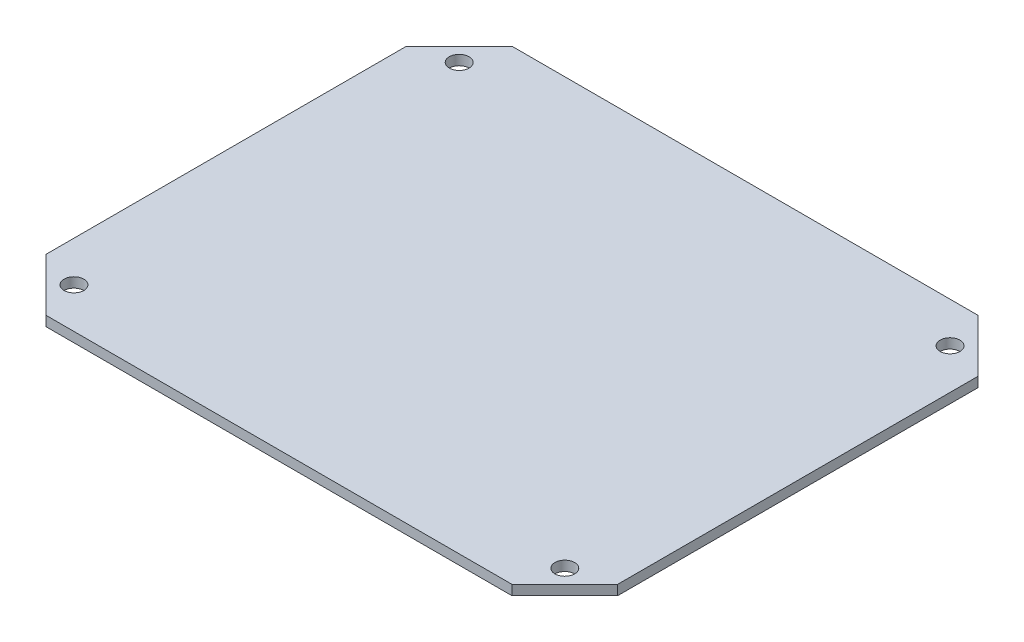
ISO-10303-21;
HEADER;
FILE_DESCRIPTION(('STEP AP214'),'2;1');
FILE_NAME('part.step','',(''),(''),'','','');
FILE_SCHEMA(('AUTOMOTIVE_DESIGN { 1 0 10303 214 1 1 1 1 }'));
ENDSEC;
DATA;
#1=APPLICATION_CONTEXT('core data for automotive mechanical design processes');
#2=APPLICATION_PROTOCOL_DEFINITION('international standard','automotive_design',2000,#1);
#3=PRODUCT_CONTEXT('',#1,'mechanical');
#4=PRODUCT('Part','Part','',(#3));
#5=PRODUCT_RELATED_PRODUCT_CATEGORY('part','',(#4));
#6=PRODUCT_DEFINITION_FORMATION('','',#4);
#7=PRODUCT_DEFINITION_CONTEXT('part definition',#1,'design');
#8=PRODUCT_DEFINITION('design','',#6,#7);
#9=PRODUCT_DEFINITION_SHAPE('','',#8);
#10=(LENGTH_UNIT() NAMED_UNIT(*) SI_UNIT(.MILLI.,.METRE.));
#11=(NAMED_UNIT(*) PLANE_ANGLE_UNIT() SI_UNIT($,.RADIAN.));
#12=(NAMED_UNIT(*) SI_UNIT($,.STERADIAN.) SOLID_ANGLE_UNIT());
#13=UNCERTAINTY_MEASURE_WITH_UNIT(LENGTH_MEASURE(1.E-05),#10,'distance_accuracy_value','');
#14=(GEOMETRIC_REPRESENTATION_CONTEXT(3) GLOBAL_UNCERTAINTY_ASSIGNED_CONTEXT((#13)) GLOBAL_UNIT_ASSIGNED_CONTEXT((#10,
#11,#12)) REPRESENTATION_CONTEXT('',''));
#15=CARTESIAN_POINT('',(0.,0.,0.));
#16=DIRECTION('',(0.,0.,1.));
#17=DIRECTION('',(1.,0.,0.));
#18=AXIS2_PLACEMENT_3D('',#15,#16,#17);
#19=CARTESIAN_POINT('',(-46.,1.59,37.5));
#20=DIRECTION('',(0.,0.,-1.));
#21=DIRECTION('',(-1.,0.,0.));
#22=AXIS2_PLACEMENT_3D('',#19,#20,#21);
#23=PLANE('',#22);
#24=DIRECTION('',(1.,0.,0.));
#25=VECTOR('',#24,1.);
#26=CARTESIAN_POINT('',(-46.,1.59,37.5));
#27=LINE('',#26,#25);
#28=CARTESIAN_POINT('',(-37.5,1.59,37.5));
#29=VERTEX_POINT('',#28);
#30=CARTESIAN_POINT('',(37.4999999999999,1.59,37.5));
#31=VERTEX_POINT('',#30);
#32=EDGE_CURVE('E129',#29,#31,#27,.T.);
#33=ORIENTED_EDGE('',*,*,#32,.F.);
#34=DIRECTION('',(0.,-1.,0.));
#35=VECTOR('',#34,1.);
#36=CARTESIAN_POINT('',(-37.5,0.,37.5));
#37=LINE('',#36,#35);
#38=CARTESIAN_POINT('',(-37.5,0.,37.5));
#39=VERTEX_POINT('',#38);
#40=EDGE_CURVE('E113',#29,#39,#37,.T.);
#41=ORIENTED_EDGE('',*,*,#40,.T.);
#42=DIRECTION('',(1.,0.,0.));
#43=VECTOR('',#42,1.);
#44=CARTESIAN_POINT('',(-46.,0.,37.5));
#45=LINE('',#44,#43);
#46=CARTESIAN_POINT('',(37.4999999999999,0.,37.5));
#47=VERTEX_POINT('',#46);
#48=EDGE_CURVE('E126',#39,#47,#45,.T.);
#49=ORIENTED_EDGE('',*,*,#48,.T.);
#50=DIRECTION('',(0.,1.,0.));
#51=VECTOR('',#50,1.);
#52=CARTESIAN_POINT('',(37.4999999999999,1.59,37.5));
#53=LINE('',#52,#51);
#54=EDGE_CURVE('E132',#47,#31,#53,.T.);
#55=ORIENTED_EDGE('',*,*,#54,.T.);
#56=EDGE_LOOP('',(#33,#41,#49,#55));
#57=FACE_BOUND('',#56,.T.);
#58=ADVANCED_FACE('F41',(#57),#23,.F.);
#59=CARTESIAN_POINT('',(46.,1.59,37.5));
#60=DIRECTION('',(-1.,0.,0.));
#61=DIRECTION('',(0.,0.,1.));
#62=AXIS2_PLACEMENT_3D('',#59,#60,#61);
#63=PLANE('',#62);
#64=DIRECTION('',(0.,0.,-1.));
#65=VECTOR('',#64,1.);
#66=CARTESIAN_POINT('',(46.,0.,37.5));
#67=LINE('',#66,#65);
#68=CARTESIAN_POINT('',(46.,0.,29.));
#69=VERTEX_POINT('',#68);
#70=CARTESIAN_POINT('',(46.,0.,-29.));
#71=VERTEX_POINT('',#70);
#72=EDGE_CURVE('E137',#69,#71,#67,.T.);
#73=ORIENTED_EDGE('',*,*,#72,.T.);
#74=DIRECTION('',(0.,1.,0.));
#75=VECTOR('',#74,1.);
#76=CARTESIAN_POINT('',(46.,1.59,-29.));
#77=LINE('',#76,#75);
#78=CARTESIAN_POINT('',(46.,1.59,-29.));
#79=VERTEX_POINT('',#78);
#80=EDGE_CURVE('E11',#71,#79,#77,.T.);
#81=ORIENTED_EDGE('',*,*,#80,.T.);
#82=DIRECTION('',(0.,0.,-1.));
#83=VECTOR('',#82,1.);
#84=CARTESIAN_POINT('',(46.,1.59,37.5));
#85=LINE('',#84,#83);
#86=CARTESIAN_POINT('',(46.,1.59,29.));
#87=VERTEX_POINT('',#86);
#88=EDGE_CURVE('E195',#87,#79,#85,.T.);
#89=ORIENTED_EDGE('',*,*,#88,.F.);
#90=DIRECTION('',(0.,-1.,0.));
#91=VECTOR('',#90,1.);
#92=CARTESIAN_POINT('',(46.,1.59,29.));
#93=LINE('',#92,#91);
#94=EDGE_CURVE('E51',#87,#69,#93,.T.);
#95=ORIENTED_EDGE('',*,*,#94,.T.);
#96=EDGE_LOOP('',(#73,#81,#89,#95));
#97=FACE_BOUND('',#96,.T.);
#98=ADVANCED_FACE('F193',(#97),#63,.F.);
#99=CARTESIAN_POINT('',(-46.,1.59,-37.5));
#100=DIRECTION('',(0.,0.,-1.));
#101=DIRECTION('',(-1.,0.,0.));
#102=AXIS2_PLACEMENT_3D('',#99,#100,#101);
#103=PLANE('',#102);
#104=DIRECTION('',(1.,0.,0.));
#105=VECTOR('',#104,1.);
#106=CARTESIAN_POINT('',(-46.,0.,-37.5));
#107=LINE('',#106,#105);
#108=CARTESIAN_POINT('',(-37.5,0.,-37.5));
#109=VERTEX_POINT('',#108);
#110=CARTESIAN_POINT('',(37.5,0.,-37.5));
#111=VERTEX_POINT('',#110);
#112=EDGE_CURVE('E143',#109,#111,#107,.T.);
#113=ORIENTED_EDGE('',*,*,#112,.F.);
#114=DIRECTION('',(0.,1.,0.));
#115=VECTOR('',#114,1.);
#116=CARTESIAN_POINT('',(-37.5,1.59,-37.5));
#117=LINE('',#116,#115);
#118=CARTESIAN_POINT('',(-37.5,1.59,-37.5));
#119=VERTEX_POINT('',#118);
#120=EDGE_CURVE('E65',#109,#119,#117,.T.);
#121=ORIENTED_EDGE('',*,*,#120,.T.);
#122=DIRECTION('',(1.,0.,0.));
#123=VECTOR('',#122,1.);
#124=CARTESIAN_POINT('',(-46.,1.59,-37.5));
#125=LINE('',#124,#123);
#126=CARTESIAN_POINT('',(37.5,1.59,-37.5));
#127=VERTEX_POINT('',#126);
#128=EDGE_CURVE('E202',#119,#127,#125,.T.);
#129=ORIENTED_EDGE('',*,*,#128,.T.);
#130=DIRECTION('',(0.,-1.,0.));
#131=VECTOR('',#130,1.);
#132=CARTESIAN_POINT('',(37.5,0.,-37.5));
#133=LINE('',#132,#131);
#134=EDGE_CURVE('E183',#127,#111,#133,.T.);
#135=ORIENTED_EDGE('',*,*,#134,.T.);
#136=EDGE_LOOP('',(#113,#121,#129,#135));
#137=FACE_BOUND('',#136,.T.);
#138=ADVANCED_FACE('F201',(#137),#103,.T.);
#139=CARTESIAN_POINT('',(-46.,1.59,37.5));
#140=DIRECTION('',(-1.,0.,0.));
#141=DIRECTION('',(0.,0.,1.));
#142=AXIS2_PLACEMENT_3D('',#139,#140,#141);
#143=PLANE('',#142);
#144=DIRECTION('',(0.,0.,-1.));
#145=VECTOR('',#144,1.);
#146=CARTESIAN_POINT('',(-46.,0.,37.5));
#147=LINE('',#146,#145);
#148=CARTESIAN_POINT('',(-46.,0.,29.));
#149=VERTEX_POINT('',#148);
#150=CARTESIAN_POINT('',(-46.,0.,-29.));
#151=VERTEX_POINT('',#150);
#152=EDGE_CURVE('E155',#149,#151,#147,.T.);
#153=ORIENTED_EDGE('',*,*,#152,.F.);
#154=DIRECTION('',(0.,1.,0.));
#155=VECTOR('',#154,1.);
#156=CARTESIAN_POINT('',(-46.,1.59,29.));
#157=LINE('',#156,#155);
#158=CARTESIAN_POINT('',(-46.,1.59,29.));
#159=VERTEX_POINT('',#158);
#160=EDGE_CURVE('E114',#149,#159,#157,.T.);
#161=ORIENTED_EDGE('',*,*,#160,.T.);
#162=DIRECTION('',(0.,0.,-1.));
#163=VECTOR('',#162,1.);
#164=CARTESIAN_POINT('',(-46.,1.59,37.5));
#165=LINE('',#164,#163);
#166=CARTESIAN_POINT('',(-46.,1.59,-29.));
#167=VERTEX_POINT('',#166);
#168=EDGE_CURVE('E149',#159,#167,#165,.T.);
#169=ORIENTED_EDGE('',*,*,#168,.T.);
#170=DIRECTION('',(0.,-1.,0.));
#171=VECTOR('',#170,1.);
#172=CARTESIAN_POINT('',(-46.,1.59,-29.));
#173=LINE('',#172,#171);
#174=EDGE_CURVE('E120',#167,#151,#173,.T.);
#175=ORIENTED_EDGE('',*,*,#174,.T.);
#176=EDGE_LOOP('',(#153,#161,#169,#175));
#177=FACE_BOUND('',#176,.T.);
#178=ADVANCED_FACE('F245',(#177),#143,.T.);
#179=CARTESIAN_POINT('',(0.,1.59,0.));
#180=DIRECTION('',(0.,1.,0.));
#181=DIRECTION('',(0.,0.,1.));
#182=AXIS2_PLACEMENT_3D('',#179,#180,#181);
#183=PLANE('',#182);
#184=CARTESIAN_POINT('',(-39.5,1.59,-31.));
#185=DIRECTION('',(0.,1.,0.));
#186=DIRECTION('',(0.,0.,1.));
#187=AXIS2_PLACEMENT_3D('',#184,#185,#186);
#188=CIRCLE('',#187,1.58999999999999);
#189=CARTESIAN_POINT('',(-39.5,1.59,-29.41));
#190=VERTEX_POINT('',#189);
#191=EDGE_CURVE('E235',#190,#190,#188,.T.);
#192=ORIENTED_EDGE('',*,*,#191,.F.);
#193=EDGE_LOOP('',(#192));
#194=FACE_BOUND('',#193,.T.);
#195=CARTESIAN_POINT('',(39.5,1.59,-31.));
#196=DIRECTION('',(0.,1.,0.));
#197=DIRECTION('',(0.,0.,1.));
#198=AXIS2_PLACEMENT_3D('',#195,#196,#197);
#199=CIRCLE('',#198,1.58999999999999);
#200=CARTESIAN_POINT('',(39.5,1.59,-29.41));
#201=VERTEX_POINT('',#200);
#202=EDGE_CURVE('E227',#201,#201,#199,.T.);
#203=ORIENTED_EDGE('',*,*,#202,.F.);
#204=EDGE_LOOP('',(#203));
#205=FACE_BOUND('',#204,.T.);
#206=CARTESIAN_POINT('',(39.5,1.59,31.));
#207=DIRECTION('',(0.,1.,0.));
#208=DIRECTION('',(0.,0.,1.));
#209=AXIS2_PLACEMENT_3D('',#206,#207,#208);
#210=CIRCLE('',#209,1.58999999999999);
#211=CARTESIAN_POINT('',(39.5,1.59,32.59));
#212=VERTEX_POINT('',#211);
#213=EDGE_CURVE('E219',#212,#212,#210,.T.);
#214=ORIENTED_EDGE('',*,*,#213,.F.);
#215=EDGE_LOOP('',(#214));
#216=FACE_BOUND('',#215,.T.);
#217=CARTESIAN_POINT('',(-39.5,1.59,31.));
#218=DIRECTION('',(0.,1.,0.));
#219=DIRECTION('',(0.,0.,1.));
#220=AXIS2_PLACEMENT_3D('',#217,#218,#219);
#221=CIRCLE('',#220,1.58999999999999);
#222=CARTESIAN_POINT('',(-39.5,1.59,32.59));
#223=VERTEX_POINT('',#222);
#224=EDGE_CURVE('E146',#223,#223,#221,.T.);
#225=ORIENTED_EDGE('',*,*,#224,.F.);
#226=EDGE_LOOP('',(#225));
#227=FACE_BOUND('',#226,.T.);
#228=ORIENTED_EDGE('',*,*,#168,.F.);
#229=DIRECTION('',(0.707106781186547,0.,0.707106781186548));
#230=VECTOR('',#229,1.);
#231=CARTESIAN_POINT('',(-37.5,1.59,37.4999999999999));
#232=LINE('',#231,#230);
#233=EDGE_CURVE('E180',#159,#29,#232,.T.);
#234=ORIENTED_EDGE('',*,*,#233,.T.);
#235=ORIENTED_EDGE('',*,*,#32,.T.);
#236=DIRECTION('',(-0.70710678118655,0.,0.707106781186545));
#237=VECTOR('',#236,1.);
#238=CARTESIAN_POINT('',(37.4999999999999,1.59,37.5000000000001));
#239=LINE('',#238,#237);
#240=EDGE_CURVE('E172',#31,#87,#239,.F.);
#241=ORIENTED_EDGE('',*,*,#240,.T.);
#242=ORIENTED_EDGE('',*,*,#88,.T.);
#243=DIRECTION('',(-0.707106781186546,0.,-0.707106781186549));
#244=VECTOR('',#243,1.);
#245=CARTESIAN_POINT('',(37.5000000000001,1.59,-37.4999999999999));
#246=LINE('',#245,#244);
#247=EDGE_CURVE('E58',#79,#127,#246,.T.);
#248=ORIENTED_EDGE('',*,*,#247,.T.);
#249=ORIENTED_EDGE('',*,*,#128,.F.);
#250=DIRECTION('',(0.707106781186548,0.,-0.707106781186547));
#251=VECTOR('',#250,1.);
#252=CARTESIAN_POINT('',(-37.4999999999999,1.59,-37.5));
#253=LINE('',#252,#251);
#254=EDGE_CURVE('E177',#119,#167,#253,.F.);
#255=ORIENTED_EDGE('',*,*,#254,.T.);
#256=EDGE_LOOP('',(#228,#234,#235,#241,#242,#248,#249,#255));
#257=FACE_BOUND('',#256,.T.);
#258=ADVANCED_FACE('F242',(#194,#205,#216,#227,#257),#183,.T.);
#259=CARTESIAN_POINT('',(0.,0.,0.));
#260=DIRECTION('',(0.,1.,0.));
#261=DIRECTION('',(0.,0.,1.));
#262=AXIS2_PLACEMENT_3D('',#259,#260,#261);
#263=PLANE('',#262);
#264=CARTESIAN_POINT('',(-39.5,0.,-31.));
#265=DIRECTION('',(0.,1.,0.));
#266=DIRECTION('',(0.,0.,1.));
#267=AXIS2_PLACEMENT_3D('',#264,#265,#266);
#268=CIRCLE('',#267,1.58999999999999);
#269=CARTESIAN_POINT('',(-39.5,0.,-29.41));
#270=VERTEX_POINT('',#269);
#271=EDGE_CURVE('E231',#270,#270,#268,.T.);
#272=ORIENTED_EDGE('',*,*,#271,.T.);
#273=EDGE_LOOP('',(#272));
#274=FACE_BOUND('',#273,.T.);
#275=CARTESIAN_POINT('',(39.5,0.,-31.));
#276=DIRECTION('',(0.,1.,0.));
#277=DIRECTION('',(0.,0.,1.));
#278=AXIS2_PLACEMENT_3D('',#275,#276,#277);
#279=CIRCLE('',#278,1.58999999999999);
#280=CARTESIAN_POINT('',(39.5,0.,-29.41));
#281=VERTEX_POINT('',#280);
#282=EDGE_CURVE('E223',#281,#281,#279,.T.);
#283=ORIENTED_EDGE('',*,*,#282,.T.);
#284=EDGE_LOOP('',(#283));
#285=FACE_BOUND('',#284,.T.);
#286=CARTESIAN_POINT('',(39.5,0.,31.));
#287=DIRECTION('',(0.,1.,0.));
#288=DIRECTION('',(0.,0.,1.));
#289=AXIS2_PLACEMENT_3D('',#286,#287,#288);
#290=CIRCLE('',#289,1.58999999999999);
#291=CARTESIAN_POINT('',(39.5,0.,32.59));
#292=VERTEX_POINT('',#291);
#293=EDGE_CURVE('E215',#292,#292,#290,.T.);
#294=ORIENTED_EDGE('',*,*,#293,.T.);
#295=EDGE_LOOP('',(#294));
#296=FACE_BOUND('',#295,.T.);
#297=CARTESIAN_POINT('',(-39.5,0.,31.));
#298=DIRECTION('',(0.,1.,0.));
#299=DIRECTION('',(0.,0.,1.));
#300=AXIS2_PLACEMENT_3D('',#297,#298,#299);
#301=CIRCLE('',#300,1.58999999999999);
#302=CARTESIAN_POINT('',(-39.5,0.,32.59));
#303=VERTEX_POINT('',#302);
#304=EDGE_CURVE('E138',#303,#303,#301,.T.);
#305=ORIENTED_EDGE('',*,*,#304,.T.);
#306=EDGE_LOOP('',(#305));
#307=FACE_BOUND('',#306,.T.);
#308=ORIENTED_EDGE('',*,*,#48,.F.);
#309=DIRECTION('',(-0.707106781186547,0.,-0.707106781186548));
#310=VECTOR('',#309,1.);
#311=CARTESIAN_POINT('',(-37.5,0.,37.5));
#312=LINE('',#311,#310);
#313=EDGE_CURVE('E109',#39,#149,#312,.T.);
#314=ORIENTED_EDGE('',*,*,#313,.T.);
#315=ORIENTED_EDGE('',*,*,#152,.T.);
#316=DIRECTION('',(-0.707106781186548,0.,0.707106781186547));
#317=VECTOR('',#316,1.);
#318=CARTESIAN_POINT('',(-46.,0.,-29.));
#319=LINE('',#318,#317);
#320=EDGE_CURVE('E121',#151,#109,#319,.F.);
#321=ORIENTED_EDGE('',*,*,#320,.T.);
#322=ORIENTED_EDGE('',*,*,#112,.T.);
#323=DIRECTION('',(0.707106781186546,0.,0.707106781186549));
#324=VECTOR('',#323,1.);
#325=CARTESIAN_POINT('',(37.5,0.,-37.5));
#326=LINE('',#325,#324);
#327=EDGE_CURVE('E162',#111,#71,#326,.T.);
#328=ORIENTED_EDGE('',*,*,#327,.T.);
#329=ORIENTED_EDGE('',*,*,#72,.F.);
#330=DIRECTION('',(0.70710678118655,0.,-0.707106781186545));
#331=VECTOR('',#330,1.);
#332=CARTESIAN_POINT('',(46.,0.,29.));
#333=LINE('',#332,#331);
#334=EDGE_CURVE('E131',#69,#47,#333,.F.);
#335=ORIENTED_EDGE('',*,*,#334,.T.);
#336=EDGE_LOOP('',(#308,#314,#315,#321,#322,#328,#329,#335));
#337=FACE_BOUND('',#336,.T.);
#338=ADVANCED_FACE('F134',(#274,#285,#296,#307,#337),#263,.F.);
#339=CARTESIAN_POINT('',(-37.5,1.59,37.5));
#340=DIRECTION('',(-0.707106781186548,0.,0.707106781186547));
#341=DIRECTION('',(0.,1.,0.));
#342=AXIS2_PLACEMENT_3D('',#339,#340,#341);
#343=PLANE('',#342);
#344=ORIENTED_EDGE('',*,*,#233,.F.);
#345=ORIENTED_EDGE('',*,*,#160,.F.);
#346=ORIENTED_EDGE('',*,*,#313,.F.);
#347=ORIENTED_EDGE('',*,*,#40,.F.);
#348=EDGE_LOOP('',(#344,#345,#346,#347));
#349=FACE_BOUND('',#348,.T.);
#350=ADVANCED_FACE('F112',(#349),#343,.T.);
#351=CARTESIAN_POINT('',(-46.,1.59,-29.));
#352=DIRECTION('',(0.707106781186547,0.,0.707106781186548));
#353=DIRECTION('',(0.,-1.,0.));
#354=AXIS2_PLACEMENT_3D('',#351,#352,#353);
#355=PLANE('',#354);
#356=ORIENTED_EDGE('',*,*,#254,.F.);
#357=ORIENTED_EDGE('',*,*,#120,.F.);
#358=ORIENTED_EDGE('',*,*,#320,.F.);
#359=ORIENTED_EDGE('',*,*,#174,.F.);
#360=EDGE_LOOP('',(#356,#357,#358,#359));
#361=FACE_BOUND('',#360,.T.);
#362=ADVANCED_FACE('F256',(#361),#355,.F.);
#363=CARTESIAN_POINT('',(37.5,1.59,-37.5));
#364=DIRECTION('',(0.707106781186549,0.,-0.707106781186546));
#365=DIRECTION('',(0.,1.,0.));
#366=AXIS2_PLACEMENT_3D('',#363,#364,#365);
#367=PLANE('',#366);
#368=ORIENTED_EDGE('',*,*,#247,.F.);
#369=ORIENTED_EDGE('',*,*,#80,.F.);
#370=ORIENTED_EDGE('',*,*,#327,.F.);
#371=ORIENTED_EDGE('',*,*,#134,.F.);
#372=EDGE_LOOP('',(#368,#369,#370,#371));
#373=FACE_BOUND('',#372,.T.);
#374=ADVANCED_FACE('F200',(#373),#367,.T.);
#375=CARTESIAN_POINT('',(46.,1.59,29.));
#376=DIRECTION('',(-0.707106781186545,0.,-0.707106781186549));
#377=DIRECTION('',(0.,-1.,0.));
#378=AXIS2_PLACEMENT_3D('',#375,#376,#377);
#379=PLANE('',#378);
#380=ORIENTED_EDGE('',*,*,#240,.F.);
#381=ORIENTED_EDGE('',*,*,#54,.F.);
#382=ORIENTED_EDGE('',*,*,#334,.F.);
#383=ORIENTED_EDGE('',*,*,#94,.F.);
#384=EDGE_LOOP('',(#380,#381,#382,#383));
#385=FACE_BOUND('',#384,.T.);
#386=ADVANCED_FACE('F44',(#385),#379,.F.);
#387=CARTESIAN_POINT('',(-39.5,1.59,31.));
#388=DIRECTION('',(0.,1.,0.));
#389=DIRECTION('',(0.,0.,1.));
#390=AXIS2_PLACEMENT_3D('',#387,#388,#389);
#391=CYLINDRICAL_SURFACE('',#390,1.58999999999999);
#392=ORIENTED_EDGE('',*,*,#304,.F.);
#393=EDGE_LOOP('',(#392));
#394=FACE_BOUND('',#393,.T.);
#395=ORIENTED_EDGE('',*,*,#224,.T.);
#396=EDGE_LOOP('',(#395));
#397=FACE_BOUND('',#396,.T.);
#398=ADVANCED_FACE('F289',(#394,#397),#391,.F.);
#399=CARTESIAN_POINT('',(39.5,1.59,31.));
#400=DIRECTION('',(0.,1.,0.));
#401=DIRECTION('',(0.,0.,1.));
#402=AXIS2_PLACEMENT_3D('',#399,#400,#401);
#403=CYLINDRICAL_SURFACE('',#402,1.58999999999999);
#404=ORIENTED_EDGE('',*,*,#293,.F.);
#405=EDGE_LOOP('',(#404));
#406=FACE_BOUND('',#405,.T.);
#407=ORIENTED_EDGE('',*,*,#213,.T.);
#408=EDGE_LOOP('',(#407));
#409=FACE_BOUND('',#408,.T.);
#410=ADVANCED_FACE('F292',(#406,#409),#403,.F.);
#411=CARTESIAN_POINT('',(39.5,1.59,-31.));
#412=DIRECTION('',(0.,1.,0.));
#413=DIRECTION('',(0.,0.,1.));
#414=AXIS2_PLACEMENT_3D('',#411,#412,#413);
#415=CYLINDRICAL_SURFACE('',#414,1.58999999999999);
#416=ORIENTED_EDGE('',*,*,#282,.F.);
#417=EDGE_LOOP('',(#416));
#418=FACE_BOUND('',#417,.T.);
#419=ORIENTED_EDGE('',*,*,#202,.T.);
#420=EDGE_LOOP('',(#419));
#421=FACE_BOUND('',#420,.T.);
#422=ADVANCED_FACE('F296',(#418,#421),#415,.F.);
#423=CARTESIAN_POINT('',(-39.5,1.59,-31.));
#424=DIRECTION('',(0.,1.,0.));
#425=DIRECTION('',(0.,0.,1.));
#426=AXIS2_PLACEMENT_3D('',#423,#424,#425);
#427=CYLINDRICAL_SURFACE('',#426,1.58999999999999);
#428=ORIENTED_EDGE('',*,*,#271,.F.);
#429=EDGE_LOOP('',(#428));
#430=FACE_BOUND('',#429,.T.);
#431=ORIENTED_EDGE('',*,*,#191,.T.);
#432=EDGE_LOOP('',(#431));
#433=FACE_BOUND('',#432,.T.);
#434=ADVANCED_FACE('F240',(#430,#433),#427,.F.);
#435=CLOSED_SHELL('',(#58,#98,#138,#178,#258,#338,#350,#362,#374,#386,#398,#410,#422,#434));
#436=MANIFOLD_SOLID_BREP('B2',#435);
#437=ADVANCED_BREP_SHAPE_REPRESENTATION('',(#18,#436),#14);
#438=SHAPE_DEFINITION_REPRESENTATION(#9,#437);
ENDSEC;
END-ISO-10303-21;
